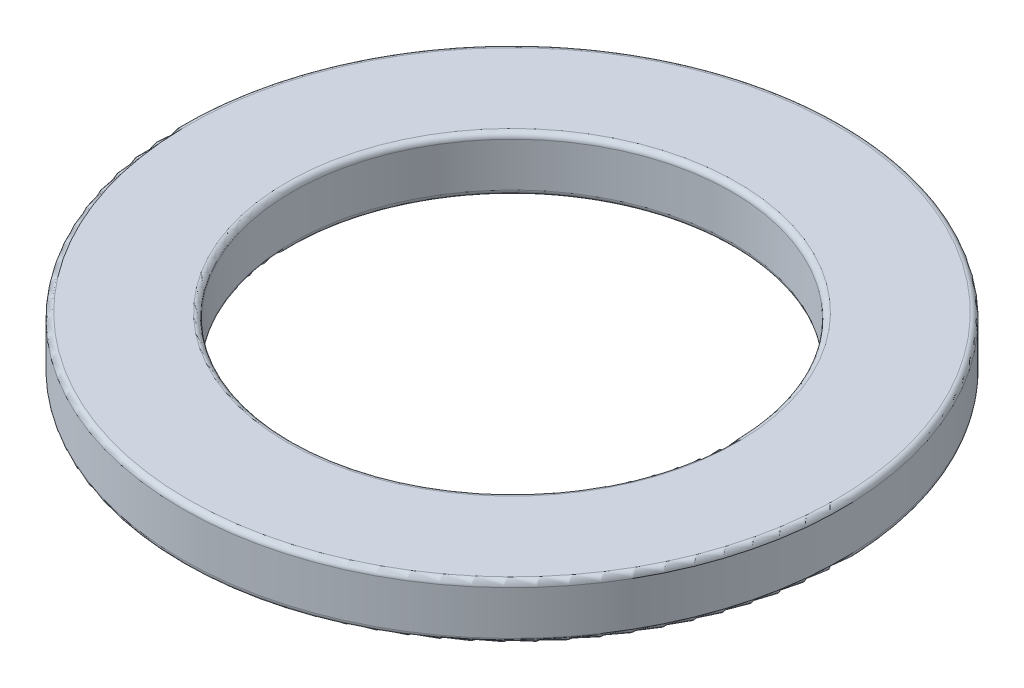
ISO-10303-21;
HEADER;
FILE_DESCRIPTION(('STEP AP214'),'2;1');
FILE_NAME('part.step','',(''),(''),'','','');
FILE_SCHEMA(('AUTOMOTIVE_DESIGN { 1 0 10303 214 1 1 1 1 }'));
ENDSEC;
DATA;
#1=APPLICATION_CONTEXT('core data for automotive mechanical design processes');
#2=APPLICATION_PROTOCOL_DEFINITION('international standard','automotive_design',2000,#1);
#3=PRODUCT_CONTEXT('',#1,'mechanical');
#4=PRODUCT('Part','Part','',(#3));
#5=PRODUCT_RELATED_PRODUCT_CATEGORY('part','',(#4));
#6=PRODUCT_DEFINITION_FORMATION('','',#4);
#7=PRODUCT_DEFINITION_CONTEXT('part definition',#1,'design');
#8=PRODUCT_DEFINITION('design','',#6,#7);
#9=PRODUCT_DEFINITION_SHAPE('','',#8);
#10=(LENGTH_UNIT() NAMED_UNIT(*) SI_UNIT(.MILLI.,.METRE.));
#11=(NAMED_UNIT(*) PLANE_ANGLE_UNIT() SI_UNIT($,.RADIAN.));
#12=(NAMED_UNIT(*) SI_UNIT($,.STERADIAN.) SOLID_ANGLE_UNIT());
#13=UNCERTAINTY_MEASURE_WITH_UNIT(LENGTH_MEASURE(1.E-05),#10,'distance_accuracy_value','');
#14=(GEOMETRIC_REPRESENTATION_CONTEXT(3) GLOBAL_UNCERTAINTY_ASSIGNED_CONTEXT((#13)) GLOBAL_UNIT_ASSIGNED_CONTEXT((#10,
#11,#12)) REPRESENTATION_CONTEXT('',''));
#15=CARTESIAN_POINT('',(0.,0.,0.));
#16=DIRECTION('',(0.,0.,1.));
#17=DIRECTION('',(1.,0.,0.));
#18=AXIS2_PLACEMENT_3D('',#15,#16,#17);
#19=CARTESIAN_POINT('',(0.,5.,0.));
#20=DIRECTION('',(0.,1.,0.));
#21=DIRECTION('',(0.,0.,1.));
#22=AXIS2_PLACEMENT_3D('',#19,#20,#21);
#23=PLANE('',#22);
#24=CARTESIAN_POINT('',(0.,5.,0.));
#25=DIRECTION('',(0.,1.,0.));
#26=DIRECTION('',(0.,0.,1.));
#27=AXIS2_PLACEMENT_3D('',#24,#25,#26);
#28=CIRCLE('',#27,20.5);
#29=CARTESIAN_POINT('',(0.,5.,20.5));
#30=VERTEX_POINT('',#29);
#31=EDGE_CURVE('E41',#30,#30,#28,.F.);
#32=ORIENTED_EDGE('',*,*,#31,.T.);
#33=EDGE_LOOP('',(#32));
#34=FACE_BOUND('',#33,.T.);
#35=CARTESIAN_POINT('',(0.,5.,0.));
#36=DIRECTION('',(0.,1.,0.));
#37=DIRECTION('',(0.,0.,1.));
#38=AXIS2_PLACEMENT_3D('',#35,#36,#37);
#39=CIRCLE('',#38,29.5);
#40=CARTESIAN_POINT('',(0.,5.,29.5));
#41=VERTEX_POINT('',#40);
#42=EDGE_CURVE('E45',#41,#41,#39,.T.);
#43=ORIENTED_EDGE('',*,*,#42,.T.);
#44=EDGE_LOOP('',(#43));
#45=FACE_BOUND('',#44,.T.);
#46=ADVANCED_FACE('F30',(#34,#45),#23,.T.);
#47=CARTESIAN_POINT('',(0.,0.,0.));
#48=DIRECTION('',(0.,1.,0.));
#49=DIRECTION('',(0.,0.,1.));
#50=AXIS2_PLACEMENT_3D('',#47,#48,#49);
#51=PLANE('',#50);
#52=CARTESIAN_POINT('',(0.,0.,0.));
#53=DIRECTION('',(0.,1.,0.));
#54=DIRECTION('',(0.,0.,1.));
#55=AXIS2_PLACEMENT_3D('',#52,#53,#54);
#56=CIRCLE('',#55,20.5);
#57=CARTESIAN_POINT('',(0.,0.,20.5));
#58=VERTEX_POINT('',#57);
#59=EDGE_CURVE('E56',#58,#58,#56,.T.);
#60=ORIENTED_EDGE('',*,*,#59,.T.);
#61=EDGE_LOOP('',(#60));
#62=FACE_BOUND('',#61,.T.);
#63=CARTESIAN_POINT('',(0.,0.,0.));
#64=DIRECTION('',(0.,1.,0.));
#65=DIRECTION('',(0.,0.,1.));
#66=AXIS2_PLACEMENT_3D('',#63,#64,#65);
#67=CIRCLE('',#66,29.5);
#68=CARTESIAN_POINT('',(0.,0.,29.5));
#69=VERTEX_POINT('',#68);
#70=EDGE_CURVE('E59',#69,#69,#67,.F.);
#71=ORIENTED_EDGE('',*,*,#70,.T.);
#72=EDGE_LOOP('',(#71));
#73=FACE_BOUND('',#72,.T.);
#74=ADVANCED_FACE('F63',(#62,#73),#51,.F.);
#75=CARTESIAN_POINT('',(0.,5.,0.));
#76=DIRECTION('',(0.,-1.,0.));
#77=DIRECTION('',(0.,0.,-1.));
#78=AXIS2_PLACEMENT_3D('',#75,#76,#77);
#79=CYLINDRICAL_SURFACE('',#78,30.);
#80=CARTESIAN_POINT('',(0.,0.5,0.));
#81=DIRECTION('',(0.,1.,0.));
#82=DIRECTION('',(0.,0.,1.));
#83=AXIS2_PLACEMENT_3D('',#80,#81,#82);
#84=CIRCLE('',#83,30.);
#85=CARTESIAN_POINT('',(0.,0.5,30.));
#86=VERTEX_POINT('',#85);
#87=EDGE_CURVE('E10',#86,#86,#84,.T.);
#88=ORIENTED_EDGE('',*,*,#87,.T.);
#89=EDGE_LOOP('',(#88));
#90=FACE_BOUND('',#89,.T.);
#91=CARTESIAN_POINT('',(0.,4.5,0.));
#92=DIRECTION('',(0.,1.,0.));
#93=DIRECTION('',(0.,0.,1.));
#94=AXIS2_PLACEMENT_3D('',#91,#92,#93);
#95=CIRCLE('',#94,30.);
#96=CARTESIAN_POINT('',(0.,4.5,30.));
#97=VERTEX_POINT('',#96);
#98=EDGE_CURVE('E37',#97,#97,#95,.F.);
#99=ORIENTED_EDGE('',*,*,#98,.T.);
#100=EDGE_LOOP('',(#99));
#101=FACE_BOUND('',#100,.T.);
#102=ADVANCED_FACE('F83',(#90,#101),#79,.T.);
#103=CARTESIAN_POINT('',(0.,5.,0.));
#104=DIRECTION('',(0.,-1.,0.));
#105=DIRECTION('',(0.,0.,-1.));
#106=AXIS2_PLACEMENT_3D('',#103,#104,#105);
#107=CYLINDRICAL_SURFACE('',#106,20.);
#108=CARTESIAN_POINT('',(0.,0.5,0.));
#109=DIRECTION('',(0.,1.,0.));
#110=DIRECTION('',(0.,0.,1.));
#111=AXIS2_PLACEMENT_3D('',#108,#109,#110);
#112=CIRCLE('',#111,20.);
#113=CARTESIAN_POINT('',(0.,0.5,20.));
#114=VERTEX_POINT('',#113);
#115=EDGE_CURVE('E50',#114,#114,#112,.F.);
#116=ORIENTED_EDGE('',*,*,#115,.T.);
#117=EDGE_LOOP('',(#116));
#118=FACE_BOUND('',#117,.T.);
#119=CARTESIAN_POINT('',(0.,4.5,0.));
#120=DIRECTION('',(0.,1.,0.));
#121=DIRECTION('',(0.,0.,1.));
#122=AXIS2_PLACEMENT_3D('',#119,#120,#121);
#123=CIRCLE('',#122,20.);
#124=CARTESIAN_POINT('',(0.,4.5,20.));
#125=VERTEX_POINT('',#124);
#126=EDGE_CURVE('E53',#125,#125,#123,.T.);
#127=ORIENTED_EDGE('',*,*,#126,.T.);
#128=EDGE_LOOP('',(#127));
#129=FACE_BOUND('',#128,.T.);
#130=ADVANCED_FACE('F88',(#118,#129),#107,.F.);
#131=CARTESIAN_POINT('',(0.,0.5,0.));
#132=DIRECTION('',(0.,1.,0.));
#133=DIRECTION('',(0.,0.,1.));
#134=AXIS2_PLACEMENT_3D('',#131,#132,#133);
#135=TOROIDAL_SURFACE('',#134,20.5,0.5);
#136=ORIENTED_EDGE('',*,*,#115,.F.);
#137=EDGE_LOOP('',(#136));
#138=FACE_BOUND('',#137,.T.);
#139=ORIENTED_EDGE('',*,*,#59,.F.);
#140=EDGE_LOOP('',(#139));
#141=FACE_BOUND('',#140,.T.);
#142=ADVANCED_FACE('F74',(#138,#141),#135,.T.);
#143=CARTESIAN_POINT('',(0.,4.5,0.));
#144=DIRECTION('',(0.,1.,0.));
#145=DIRECTION('',(0.,0.,1.));
#146=AXIS2_PLACEMENT_3D('',#143,#144,#145);
#147=TOROIDAL_SURFACE('',#146,20.5,0.5);
#148=ORIENTED_EDGE('',*,*,#31,.F.);
#149=EDGE_LOOP('',(#148));
#150=FACE_BOUND('',#149,.T.);
#151=ORIENTED_EDGE('',*,*,#126,.F.);
#152=EDGE_LOOP('',(#151));
#153=FACE_BOUND('',#152,.T.);
#154=ADVANCED_FACE('F68',(#150,#153),#147,.T.);
#155=CARTESIAN_POINT('',(0.,0.5,0.));
#156=DIRECTION('',(0.,1.,0.));
#157=DIRECTION('',(0.,0.,1.));
#158=AXIS2_PLACEMENT_3D('',#155,#156,#157);
#159=TOROIDAL_SURFACE('',#158,29.5,0.5);
#160=ORIENTED_EDGE('',*,*,#70,.F.);
#161=EDGE_LOOP('',(#160));
#162=FACE_BOUND('',#161,.T.);
#163=ORIENTED_EDGE('',*,*,#87,.F.);
#164=EDGE_LOOP('',(#163));
#165=FACE_BOUND('',#164,.T.);
#166=ADVANCED_FACE('F65',(#162,#165),#159,.T.);
#167=CARTESIAN_POINT('',(0.,4.5,0.));
#168=DIRECTION('',(0.,1.,0.));
#169=DIRECTION('',(0.,0.,1.));
#170=AXIS2_PLACEMENT_3D('',#167,#168,#169);
#171=TOROIDAL_SURFACE('',#170,29.5,0.5);
#172=ORIENTED_EDGE('',*,*,#98,.F.);
#173=EDGE_LOOP('',(#172));
#174=FACE_BOUND('',#173,.T.);
#175=ORIENTED_EDGE('',*,*,#42,.F.);
#176=EDGE_LOOP('',(#175));
#177=FACE_BOUND('',#176,.T.);
#178=ADVANCED_FACE('F32',(#174,#177),#171,.T.);
#179=CLOSED_SHELL('',(#46,#74,#102,#130,#142,#154,#166,#178));
#180=MANIFOLD_SOLID_BREP('B2',#179);
#181=ADVANCED_BREP_SHAPE_REPRESENTATION('',(#18,#180),#14);
#182=SHAPE_DEFINITION_REPRESENTATION(#9,#181);
ENDSEC;
END-ISO-10303-21;
